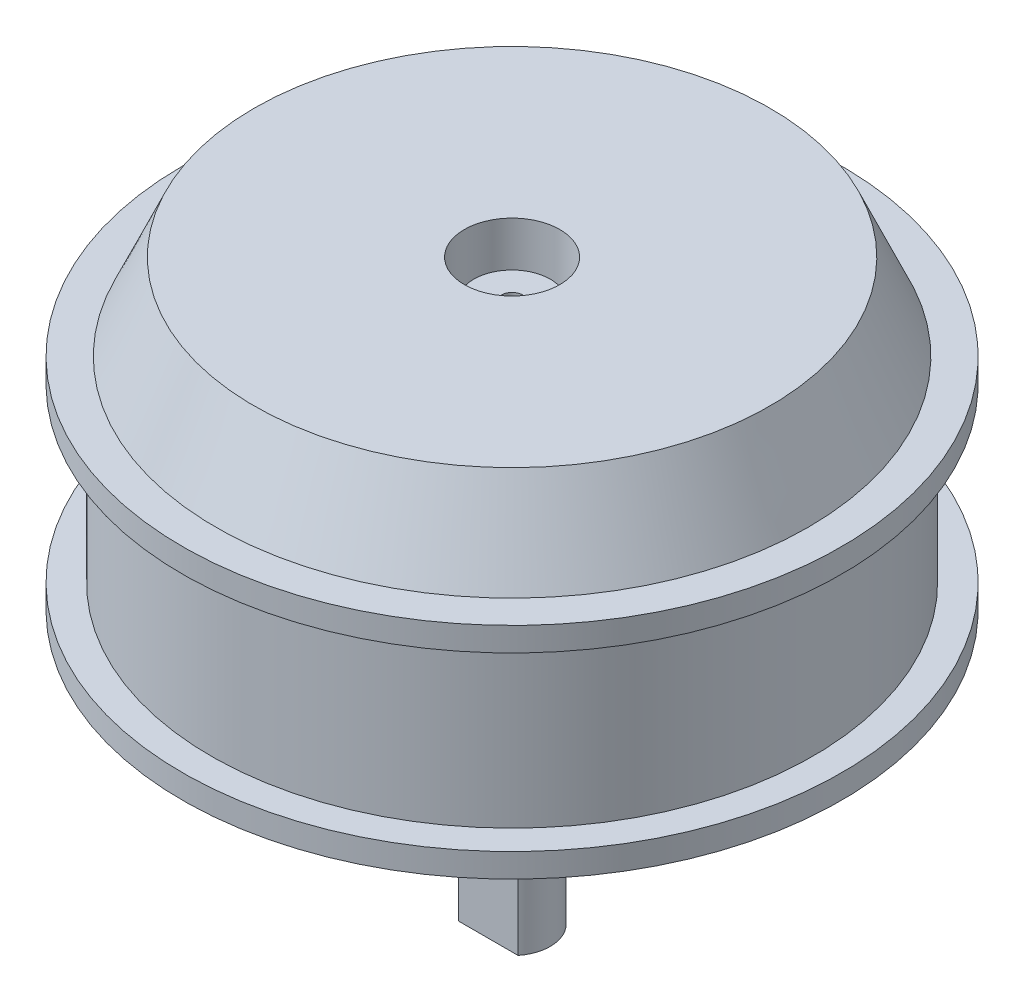
ISO-10303-21;
HEADER;
FILE_DESCRIPTION(('STEP AP214'),'2;1');
FILE_NAME('part.step','',(''),(''),'','','');
FILE_SCHEMA(('AUTOMOTIVE_DESIGN { 1 0 10303 214 1 1 1 1 }'));
ENDSEC;
DATA;
#1=APPLICATION_CONTEXT('core data for automotive mechanical design processes');
#2=APPLICATION_PROTOCOL_DEFINITION('international standard','automotive_design',2000,#1);
#3=PRODUCT_CONTEXT('',#1,'mechanical');
#4=PRODUCT('Part','Part','',(#3));
#5=PRODUCT_RELATED_PRODUCT_CATEGORY('part','',(#4));
#6=PRODUCT_DEFINITION_FORMATION('','',#4);
#7=PRODUCT_DEFINITION_CONTEXT('part definition',#1,'design');
#8=PRODUCT_DEFINITION('design','',#6,#7);
#9=PRODUCT_DEFINITION_SHAPE('','',#8);
#10=(LENGTH_UNIT() NAMED_UNIT(*) SI_UNIT(.MILLI.,.METRE.));
#11=(NAMED_UNIT(*) PLANE_ANGLE_UNIT() SI_UNIT($,.RADIAN.));
#12=(NAMED_UNIT(*) SI_UNIT($,.STERADIAN.) SOLID_ANGLE_UNIT());
#13=UNCERTAINTY_MEASURE_WITH_UNIT(LENGTH_MEASURE(1.E-05),#10,'distance_accuracy_value','');
#14=(GEOMETRIC_REPRESENTATION_CONTEXT(3) GLOBAL_UNCERTAINTY_ASSIGNED_CONTEXT((#13)) GLOBAL_UNIT_ASSIGNED_CONTEXT((#10,
#11,#12)) REPRESENTATION_CONTEXT('',''));
#15=CARTESIAN_POINT('',(0.,0.,0.));
#16=DIRECTION('',(0.,0.,1.));
#17=DIRECTION('',(1.,0.,0.));
#18=AXIS2_PLACEMENT_3D('',#15,#16,#17);
#19=CARTESIAN_POINT('',(0.,0.,0.));
#20=DIRECTION('',(0.,-1.,0.));
#21=DIRECTION('',(1.,0.,0.));
#22=AXIS2_PLACEMENT_3D('',#19,#20,#21);
#23=CONICAL_SURFACE('',#22,54.,0.418224329579229);
#24=CARTESIAN_POINT('',(0.,-18.,0.));
#25=DIRECTION('',(0.,1.,0.));
#26=DIRECTION('',(-1.,0.,0.));
#27=AXIS2_PLACEMENT_3D('',#24,#25,#26);
#28=CIRCLE('',#27,62.);
#29=CARTESIAN_POINT('',(-62.,-18.,0.));
#30=VERTEX_POINT('',#29);
#31=EDGE_CURVE('E207',#30,#30,#28,.T.);
#32=ORIENTED_EDGE('',*,*,#31,.T.);
#33=EDGE_LOOP('',(#32));
#34=FACE_BOUND('',#33,.T.);
#35=CARTESIAN_POINT('',(0.,0.,0.));
#36=DIRECTION('',(0.,1.,0.));
#37=DIRECTION('',(-1.,0.,0.));
#38=AXIS2_PLACEMENT_3D('',#35,#36,#37);
#39=CIRCLE('',#38,54.);
#40=CARTESIAN_POINT('',(-54.,0.,0.));
#41=VERTEX_POINT('',#40);
#42=EDGE_CURVE('E168',#41,#41,#39,.T.);
#43=ORIENTED_EDGE('',*,*,#42,.F.);
#44=EDGE_LOOP('',(#43));
#45=FACE_BOUND('',#44,.T.);
#46=ADVANCED_FACE('F38',(#34,#45),#23,.T.);
#47=CARTESIAN_POINT('',(-62.,-18.,0.));
#48=DIRECTION('',(0.,1.,0.));
#49=DIRECTION('',(-1.,0.,0.));
#50=AXIS2_PLACEMENT_3D('',#47,#48,#49);
#51=PLANE('',#50);
#52=CARTESIAN_POINT('',(0.,-18.,0.));
#53=DIRECTION('',(0.,1.,0.));
#54=DIRECTION('',(-1.,0.,0.));
#55=AXIS2_PLACEMENT_3D('',#52,#53,#54);
#56=CIRCLE('',#55,69.);
#57=CARTESIAN_POINT('',(-69.,-18.,0.));
#58=VERTEX_POINT('',#57);
#59=EDGE_CURVE('E204',#58,#58,#56,.T.);
#60=ORIENTED_EDGE('',*,*,#59,.T.);
#61=EDGE_LOOP('',(#60));
#62=FACE_BOUND('',#61,.T.);
#63=ORIENTED_EDGE('',*,*,#31,.F.);
#64=EDGE_LOOP('',(#63));
#65=FACE_BOUND('',#64,.T.);
#66=ADVANCED_FACE('F229',(#62,#65),#51,.T.);
#67=CARTESIAN_POINT('',(0.,-8.00000000000002,0.));
#68=DIRECTION('',(0.,1.,0.));
#69=DIRECTION('',(-1.,0.,0.));
#70=AXIS2_PLACEMENT_3D('',#67,#68,#69);
#71=CYLINDRICAL_SURFACE('',#70,69.);
#72=CARTESIAN_POINT('',(0.,-23.,0.));
#73=DIRECTION('',(0.,1.,0.));
#74=DIRECTION('',(-1.,0.,0.));
#75=AXIS2_PLACEMENT_3D('',#72,#73,#74);
#76=CIRCLE('',#75,69.);
#77=CARTESIAN_POINT('',(-69.,-23.,0.));
#78=VERTEX_POINT('',#77);
#79=EDGE_CURVE('E201',#78,#78,#76,.T.);
#80=ORIENTED_EDGE('',*,*,#79,.T.);
#81=EDGE_LOOP('',(#80));
#82=FACE_BOUND('',#81,.T.);
#83=ORIENTED_EDGE('',*,*,#59,.F.);
#84=EDGE_LOOP('',(#83));
#85=FACE_BOUND('',#84,.T.);
#86=ADVANCED_FACE('F234',(#82,#85),#71,.T.);
#87=CARTESIAN_POINT('',(-69.,-23.,0.));
#88=DIRECTION('',(0.,-1.,0.));
#89=DIRECTION('',(1.,0.,0.));
#90=AXIS2_PLACEMENT_3D('',#87,#88,#89);
#91=PLANE('',#90);
#92=CARTESIAN_POINT('',(0.,-23.,0.));
#93=DIRECTION('',(0.,1.,0.));
#94=DIRECTION('',(-1.,0.,0.));
#95=AXIS2_PLACEMENT_3D('',#92,#93,#94);
#96=CIRCLE('',#95,63.);
#97=CARTESIAN_POINT('',(-63.,-23.,0.));
#98=VERTEX_POINT('',#97);
#99=EDGE_CURVE('E198',#98,#98,#96,.T.);
#100=ORIENTED_EDGE('',*,*,#99,.T.);
#101=EDGE_LOOP('',(#100));
#102=FACE_BOUND('',#101,.T.);
#103=ORIENTED_EDGE('',*,*,#79,.F.);
#104=EDGE_LOOP('',(#103));
#105=FACE_BOUND('',#104,.T.);
#106=ADVANCED_FACE('F296',(#102,#105),#91,.T.);
#107=CARTESIAN_POINT('',(0.,-8.00000000000002,0.));
#108=DIRECTION('',(0.,1.,0.));
#109=DIRECTION('',(-1.,0.,0.));
#110=AXIS2_PLACEMENT_3D('',#107,#108,#109);
#111=CYLINDRICAL_SURFACE('',#110,63.);
#112=CARTESIAN_POINT('',(0.,-59.,0.));
#113=DIRECTION('',(0.,1.,0.));
#114=DIRECTION('',(-1.,0.,0.));
#115=AXIS2_PLACEMENT_3D('',#112,#113,#114);
#116=CIRCLE('',#115,63.);
#117=CARTESIAN_POINT('',(-63.,-59.,0.));
#118=VERTEX_POINT('',#117);
#119=EDGE_CURVE('E195',#118,#118,#116,.T.);
#120=ORIENTED_EDGE('',*,*,#119,.T.);
#121=EDGE_LOOP('',(#120));
#122=FACE_BOUND('',#121,.T.);
#123=ORIENTED_EDGE('',*,*,#99,.F.);
#124=EDGE_LOOP('',(#123));
#125=FACE_BOUND('',#124,.T.);
#126=ADVANCED_FACE('F292',(#122,#125),#111,.T.);
#127=CARTESIAN_POINT('',(-63.,-59.,0.));
#128=DIRECTION('',(0.,1.,0.));
#129=DIRECTION('',(-1.,0.,0.));
#130=AXIS2_PLACEMENT_3D('',#127,#128,#129);
#131=PLANE('',#130);
#132=CARTESIAN_POINT('',(0.,-59.,0.));
#133=DIRECTION('',(0.,1.,0.));
#134=DIRECTION('',(-1.,0.,0.));
#135=AXIS2_PLACEMENT_3D('',#132,#133,#134);
#136=CIRCLE('',#135,69.);
#137=CARTESIAN_POINT('',(-69.,-59.,0.));
#138=VERTEX_POINT('',#137);
#139=EDGE_CURVE('E192',#138,#138,#136,.T.);
#140=ORIENTED_EDGE('',*,*,#139,.T.);
#141=EDGE_LOOP('',(#140));
#142=FACE_BOUND('',#141,.T.);
#143=ORIENTED_EDGE('',*,*,#119,.F.);
#144=EDGE_LOOP('',(#143));
#145=FACE_BOUND('',#144,.T.);
#146=ADVANCED_FACE('F288',(#142,#145),#131,.T.);
#147=CARTESIAN_POINT('',(0.,-8.00000000000002,0.));
#148=DIRECTION('',(0.,1.,0.));
#149=DIRECTION('',(-1.,0.,0.));
#150=AXIS2_PLACEMENT_3D('',#147,#148,#149);
#151=CYLINDRICAL_SURFACE('',#150,69.);
#152=CARTESIAN_POINT('',(0.,-64.,0.));
#153=DIRECTION('',(0.,1.,0.));
#154=DIRECTION('',(-1.,0.,0.));
#155=AXIS2_PLACEMENT_3D('',#152,#153,#154);
#156=CIRCLE('',#155,69.);
#157=CARTESIAN_POINT('',(-69.,-64.,0.));
#158=VERTEX_POINT('',#157);
#159=EDGE_CURVE('E189',#158,#158,#156,.T.);
#160=ORIENTED_EDGE('',*,*,#159,.T.);
#161=EDGE_LOOP('',(#160));
#162=FACE_BOUND('',#161,.T.);
#163=ORIENTED_EDGE('',*,*,#139,.F.);
#164=EDGE_LOOP('',(#163));
#165=FACE_BOUND('',#164,.T.);
#166=ADVANCED_FACE('F284',(#162,#165),#151,.T.);
#167=CARTESIAN_POINT('',(-69.,-64.,0.));
#168=DIRECTION('',(0.,-1.,0.));
#169=DIRECTION('',(1.,0.,0.));
#170=AXIS2_PLACEMENT_3D('',#167,#168,#169);
#171=PLANE('',#170);
#172=CARTESIAN_POINT('',(51.3826826033579,-64.,-31.0025831017987));
#173=DIRECTION('',(0.,-1.,0.));
#174=DIRECTION('',(0.,0.,-1.));
#175=AXIS2_PLACEMENT_3D('',#172,#173,#174);
#176=CIRCLE('',#175,5.2);
#177=CARTESIAN_POINT('',(51.3826826033579,-64.,-36.2025831017987));
#178=VERTEX_POINT('',#177);
#179=EDGE_CURVE('E94',#178,#178,#176,.T.);
#180=ORIENTED_EDGE('',*,*,#179,.F.);
#181=EDGE_LOOP('',(#180));
#182=FACE_BOUND('',#181,.T.);
#183=CARTESIAN_POINT('',(52.5403658507747,-64.,28.9974168982014));
#184=DIRECTION('',(0.,-1.,0.));
#185=DIRECTION('',(0.,0.,-1.));
#186=AXIS2_PLACEMENT_3D('',#183,#184,#185);
#187=CIRCLE('',#186,5.2);
#188=CARTESIAN_POINT('',(52.5403658507747,-64.,23.7974168982014));
#189=VERTEX_POINT('',#188);
#190=EDGE_CURVE('E110',#189,#189,#187,.T.);
#191=ORIENTED_EDGE('',*,*,#190,.F.);
#192=EDGE_LOOP('',(#191));
#193=FACE_BOUND('',#192,.T.);
#194=CARTESIAN_POINT('',(1.15768324741619,-64.,60.));
#195=DIRECTION('',(0.,-1.,0.));
#196=DIRECTION('',(0.,0.,-1.));
#197=AXIS2_PLACEMENT_3D('',#194,#195,#196);
#198=CIRCLE('',#197,5.2);
#199=CARTESIAN_POINT('',(1.15768324741619,-64.,54.8));
#200=VERTEX_POINT('',#199);
#201=EDGE_CURVE('E119',#200,#200,#198,.T.);
#202=ORIENTED_EDGE('',*,*,#201,.F.);
#203=EDGE_LOOP('',(#202));
#204=FACE_BOUND('',#203,.T.);
#205=CARTESIAN_POINT('',(-51.3826826033581,-64.,31.0025831017983));
#206=DIRECTION('',(0.,-1.,0.));
#207=DIRECTION('',(0.,0.,-1.));
#208=AXIS2_PLACEMENT_3D('',#205,#206,#207);
#209=CIRCLE('',#208,5.2);
#210=CARTESIAN_POINT('',(-51.3826826033581,-64.,25.8025831017983));
#211=VERTEX_POINT('',#210);
#212=EDGE_CURVE('E128',#211,#211,#209,.T.);
#213=ORIENTED_EDGE('',*,*,#212,.F.);
#214=EDGE_LOOP('',(#213));
#215=FACE_BOUND('',#214,.T.);
#216=CARTESIAN_POINT('',(-52.5403658507745,-64.,-28.9974168982018));
#217=DIRECTION('',(0.,-1.,0.));
#218=DIRECTION('',(0.,0.,-1.));
#219=AXIS2_PLACEMENT_3D('',#216,#217,#218);
#220=CIRCLE('',#219,5.2);
#221=CARTESIAN_POINT('',(-52.5403658507745,-64.,-34.1974168982018));
#222=VERTEX_POINT('',#221);
#223=EDGE_CURVE('E137',#222,#222,#220,.T.);
#224=ORIENTED_EDGE('',*,*,#223,.F.);
#225=EDGE_LOOP('',(#224));
#226=FACE_BOUND('',#225,.T.);
#227=CARTESIAN_POINT('',(-1.15768324741619,-64.,-60.));
#228=DIRECTION('',(0.,-1.,0.));
#229=DIRECTION('',(0.,0.,-1.));
#230=AXIS2_PLACEMENT_3D('',#227,#228,#229);
#231=CIRCLE('',#230,5.2);
#232=CARTESIAN_POINT('',(-1.15768324741619,-64.,-65.2));
#233=VERTEX_POINT('',#232);
#234=EDGE_CURVE('E146',#233,#233,#231,.T.);
#235=ORIENTED_EDGE('',*,*,#234,.F.);
#236=EDGE_LOOP('',(#235));
#237=FACE_BOUND('',#236,.T.);
#238=CARTESIAN_POINT('',(0.,-64.,0.));
#239=DIRECTION('',(0.,1.,0.));
#240=DIRECTION('',(-1.,0.,0.));
#241=AXIS2_PLACEMENT_3D('',#238,#239,#240);
#242=CIRCLE('',#241,23.);
#243=CARTESIAN_POINT('',(-23.,-64.,0.));
#244=VERTEX_POINT('',#243);
#245=EDGE_CURVE('E186',#244,#244,#242,.T.);
#246=ORIENTED_EDGE('',*,*,#245,.T.);
#247=EDGE_LOOP('',(#246));
#248=FACE_BOUND('',#247,.T.);
#249=ORIENTED_EDGE('',*,*,#159,.F.);
#250=EDGE_LOOP('',(#249));
#251=FACE_BOUND('',#250,.T.);
#252=ADVANCED_FACE('F280',(#182,#193,#204,#215,#226,#237,#248,#251),#171,.T.);
#253=CARTESIAN_POINT('',(0.,-64.,0.));
#254=DIRECTION('',(0.,1.,0.));
#255=DIRECTION('',(-1.,0.,0.));
#256=AXIS2_PLACEMENT_3D('',#253,#254,#255);
#257=CONICAL_SURFACE('',#256,23.,1.15257199721567);
#258=CARTESIAN_POINT('',(0.,-68.,0.));
#259=DIRECTION('',(0.,1.,0.));
#260=DIRECTION('',(-1.,0.,0.));
#261=AXIS2_PLACEMENT_3D('',#258,#259,#260);
#262=CIRCLE('',#261,14.);
#263=CARTESIAN_POINT('',(-14.,-68.,0.));
#264=VERTEX_POINT('',#263);
#265=EDGE_CURVE('E183',#264,#264,#262,.T.);
#266=ORIENTED_EDGE('',*,*,#265,.T.);
#267=EDGE_LOOP('',(#266));
#268=FACE_BOUND('',#267,.T.);
#269=ORIENTED_EDGE('',*,*,#245,.F.);
#270=EDGE_LOOP('',(#269));
#271=FACE_BOUND('',#270,.T.);
#272=ADVANCED_FACE('F273',(#268,#271),#257,.T.);
#273=CARTESIAN_POINT('',(-14.,-68.,0.));
#274=DIRECTION('',(0.,-1.,0.));
#275=DIRECTION('',(1.,0.,0.));
#276=AXIS2_PLACEMENT_3D('',#273,#274,#275);
#277=PLANE('',#276);
#278=CARTESIAN_POINT('',(0.,-68.,0.));
#279=DIRECTION('',(0.,-1.,0.));
#280=DIRECTION('',(1.,0.,0.));
#281=AXIS2_PLACEMENT_3D('',#278,#279,#280);
#282=CIRCLE('',#281,9.95061624033845);
#283=CARTESIAN_POINT('',(9.95061624033845,-68.,0.));
#284=VERTEX_POINT('',#283);
#285=EDGE_CURVE('E739',#284,#284,#282,.T.);
#286=ORIENTED_EDGE('',*,*,#285,.F.);
#287=EDGE_LOOP('',(#286));
#288=FACE_BOUND('',#287,.T.);
#289=ORIENTED_EDGE('',*,*,#265,.F.);
#290=EDGE_LOOP('',(#289));
#291=FACE_BOUND('',#290,.T.);
#292=ADVANCED_FACE('F267',(#288,#291),#277,.T.);
#293=CARTESIAN_POINT('',(0.,-8.00000000000002,0.));
#294=DIRECTION('',(0.,1.,0.));
#295=DIRECTION('',(-1.,0.,0.));
#296=AXIS2_PLACEMENT_3D('',#293,#294,#295);
#297=PLANE('',#296);
#298=CARTESIAN_POINT('',(0.,-8.00000000000002,0.));
#299=DIRECTION('',(0.,1.,0.));
#300=DIRECTION('',(0.,0.,1.));
#301=AXIS2_PLACEMENT_3D('',#298,#299,#300);
#302=CIRCLE('',#301,2.25);
#303=CARTESIAN_POINT('',(0.,-8.00000000000002,2.25));
#304=VERTEX_POINT('',#303);
#305=EDGE_CURVE('E95',#304,#304,#302,.T.);
#306=ORIENTED_EDGE('',*,*,#305,.F.);
#307=EDGE_LOOP('',(#306));
#308=FACE_BOUND('',#307,.T.);
#309=CARTESIAN_POINT('',(0.,-8.00000000000002,0.));
#310=DIRECTION('',(0.,1.,0.));
#311=DIRECTION('',(-1.,0.,0.));
#312=AXIS2_PLACEMENT_3D('',#309,#310,#311);
#313=CIRCLE('',#312,8.);
#314=CARTESIAN_POINT('',(-8.,-8.00000000000002,0.));
#315=VERTEX_POINT('',#314);
#316=EDGE_CURVE('E180',#315,#315,#313,.T.);
#317=ORIENTED_EDGE('',*,*,#316,.T.);
#318=EDGE_LOOP('',(#317));
#319=FACE_BOUND('',#318,.T.);
#320=ADVANCED_FACE('F262',(#308,#319),#297,.T.);
#321=CARTESIAN_POINT('',(0.,-8.00000000000002,0.));
#322=DIRECTION('',(0.,1.,0.));
#323=DIRECTION('',(-1.,0.,0.));
#324=AXIS2_PLACEMENT_3D('',#321,#322,#323);
#325=CYLINDRICAL_SURFACE('',#324,8.);
#326=CARTESIAN_POINT('',(0.,-11.7305910328104,0.));
#327=DIRECTION('',(0.,1.,0.));
#328=DIRECTION('',(-1.,0.,0.));
#329=AXIS2_PLACEMENT_3D('',#326,#327,#328);
#330=CIRCLE('',#329,8.);
#331=CARTESIAN_POINT('',(-8.,-11.7305910328104,0.));
#332=VERTEX_POINT('',#331);
#333=EDGE_CURVE('E177',#332,#332,#330,.T.);
#334=ORIENTED_EDGE('',*,*,#333,.T.);
#335=EDGE_LOOP('',(#334));
#336=FACE_BOUND('',#335,.T.);
#337=ORIENTED_EDGE('',*,*,#316,.F.);
#338=EDGE_LOOP('',(#337));
#339=FACE_BOUND('',#338,.T.);
#340=ADVANCED_FACE('F256',(#336,#339),#325,.T.);
#341=CARTESIAN_POINT('',(-8.,-11.7305910328104,0.));
#342=DIRECTION('',(0.,1.,0.));
#343=DIRECTION('',(-1.,0.,0.));
#344=AXIS2_PLACEMENT_3D('',#341,#342,#343);
#345=PLANE('',#344);
#346=CARTESIAN_POINT('',(0.,-11.7305910328104,0.));
#347=DIRECTION('',(0.,1.,0.));
#348=DIRECTION('',(-1.,0.,0.));
#349=AXIS2_PLACEMENT_3D('',#346,#347,#348);
#350=CIRCLE('',#349,10.);
#351=CARTESIAN_POINT('',(-10.,-11.7305910328104,0.));
#352=VERTEX_POINT('',#351);
#353=EDGE_CURVE('E174',#352,#352,#350,.T.);
#354=ORIENTED_EDGE('',*,*,#353,.T.);
#355=EDGE_LOOP('',(#354));
#356=FACE_BOUND('',#355,.T.);
#357=ORIENTED_EDGE('',*,*,#333,.F.);
#358=EDGE_LOOP('',(#357));
#359=FACE_BOUND('',#358,.T.);
#360=ADVANCED_FACE('F250',(#356,#359),#345,.T.);
#361=CARTESIAN_POINT('',(0.,-8.00000000000002,0.));
#362=DIRECTION('',(0.,1.,0.));
#363=DIRECTION('',(-1.,0.,0.));
#364=AXIS2_PLACEMENT_3D('',#361,#362,#363);
#365=CYLINDRICAL_SURFACE('',#364,10.);
#366=CARTESIAN_POINT('',(0.,0.,0.));
#367=DIRECTION('',(0.,1.,0.));
#368=DIRECTION('',(-1.,0.,0.));
#369=AXIS2_PLACEMENT_3D('',#366,#367,#368);
#370=CIRCLE('',#369,10.);
#371=CARTESIAN_POINT('',(-10.,0.,0.));
#372=VERTEX_POINT('',#371);
#373=EDGE_CURVE('E171',#372,#372,#370,.T.);
#374=ORIENTED_EDGE('',*,*,#373,.T.);
#375=EDGE_LOOP('',(#374));
#376=FACE_BOUND('',#375,.T.);
#377=ORIENTED_EDGE('',*,*,#353,.F.);
#378=EDGE_LOOP('',(#377));
#379=FACE_BOUND('',#378,.T.);
#380=ADVANCED_FACE('F244',(#376,#379),#365,.F.);
#381=CARTESIAN_POINT('',(-10.,0.,0.));
#382=DIRECTION('',(0.,1.,0.));
#383=DIRECTION('',(-1.,0.,0.));
#384=AXIS2_PLACEMENT_3D('',#381,#382,#383);
#385=PLANE('',#384);
#386=ORIENTED_EDGE('',*,*,#42,.T.);
#387=EDGE_LOOP('',(#386));
#388=FACE_BOUND('',#387,.T.);
#389=ORIENTED_EDGE('',*,*,#373,.F.);
#390=EDGE_LOOP('',(#389));
#391=FACE_BOUND('',#390,.T.);
#392=ADVANCED_FACE('F240',(#388,#391),#385,.T.);
#393=CARTESIAN_POINT('',(-1.15768324741619,-50.,-60.));
#394=DIRECTION('',(0.,-1.,0.));
#395=DIRECTION('',(0.,0.,-1.));
#396=AXIS2_PLACEMENT_3D('',#393,#394,#395);
#397=CONICAL_SURFACE('',#396,2.74999999999999,1.02974425867665);
#398=CARTESIAN_POINT('',(-1.1576832474162,-48.3476332976742,-60.));
#399=VERTEX_POINT('',#398);
#400=VERTEX_LOOP('',#399);
#401=FACE_BOUND('',#400,.T.);
#402=CARTESIAN_POINT('',(-1.15768324741619,-50.,-60.));
#403=DIRECTION('',(0.,-1.,0.));
#404=DIRECTION('',(0.,0.,-1.));
#405=AXIS2_PLACEMENT_3D('',#402,#403,#404);
#406=CIRCLE('',#405,2.74999999999999);
#407=CARTESIAN_POINT('',(-1.15768324741619,-50.,-62.75));
#408=VERTEX_POINT('',#407);
#409=EDGE_CURVE('E152',#408,#408,#406,.T.);
#410=ORIENTED_EDGE('',*,*,#409,.T.);
#411=EDGE_LOOP('',(#410));
#412=FACE_BOUND('',#411,.T.);
#413=ADVANCED_FACE('F243',(#401,#412),#397,.F.);
#414=CARTESIAN_POINT('',(-1.15768324741619,-64.,-60.));
#415=DIRECTION('',(0.,-1.,0.));
#416=DIRECTION('',(0.,0.,-1.));
#417=AXIS2_PLACEMENT_3D('',#414,#415,#416);
#418=CYLINDRICAL_SURFACE('',#417,2.74999999999999);
#419=ORIENTED_EDGE('',*,*,#409,.F.);
#420=EDGE_LOOP('',(#419));
#421=FACE_BOUND('',#420,.T.);
#422=CARTESIAN_POINT('',(-1.15768324741619,-61.55,-60.));
#423=DIRECTION('',(0.,-1.,0.));
#424=DIRECTION('',(0.,0.,-1.));
#425=AXIS2_PLACEMENT_3D('',#422,#423,#424);
#426=CIRCLE('',#425,2.75);
#427=CARTESIAN_POINT('',(-1.15768324741619,-61.55,-62.75));
#428=VERTEX_POINT('',#427);
#429=EDGE_CURVE('E149',#428,#428,#426,.T.);
#430=ORIENTED_EDGE('',*,*,#429,.T.);
#431=EDGE_LOOP('',(#430));
#432=FACE_BOUND('',#431,.T.);
#433=ADVANCED_FACE('F556',(#421,#432),#418,.F.);
#434=CARTESIAN_POINT('',(-1.15768324741619,-64.,-60.));
#435=DIRECTION('',(0.,-1.,0.));
#436=DIRECTION('',(0.,0.,-1.));
#437=AXIS2_PLACEMENT_3D('',#434,#435,#436);
#438=CONICAL_SURFACE('',#437,5.2,0.785398163397449);
#439=ORIENTED_EDGE('',*,*,#429,.F.);
#440=EDGE_LOOP('',(#439));
#441=FACE_BOUND('',#440,.T.);
#442=ORIENTED_EDGE('',*,*,#234,.T.);
#443=EDGE_LOOP('',(#442));
#444=FACE_BOUND('',#443,.T.);
#445=ADVANCED_FACE('F547',(#441,#444),#438,.F.);
#446=CARTESIAN_POINT('',(-52.5403658507745,-50.,-28.9974168982018));
#447=DIRECTION('',(0.,-1.,0.));
#448=DIRECTION('',(0.,0.,-1.));
#449=AXIS2_PLACEMENT_3D('',#446,#447,#448);
#450=CONICAL_SURFACE('',#449,2.74999999999999,1.02974425867665);
#451=CARTESIAN_POINT('',(-52.5403658507745,-48.3476332976742,-28.9974168982018));
#452=VERTEX_POINT('',#451);
#453=VERTEX_LOOP('',#452);
#454=FACE_BOUND('',#453,.T.);
#455=CARTESIAN_POINT('',(-52.5403658507745,-50.,-28.9974168982018));
#456=DIRECTION('',(0.,-1.,0.));
#457=DIRECTION('',(0.,0.,-1.));
#458=AXIS2_PLACEMENT_3D('',#455,#456,#457);
#459=CIRCLE('',#458,2.74999999999999);
#460=CARTESIAN_POINT('',(-52.5403658507745,-50.,-31.7474168982018));
#461=VERTEX_POINT('',#460);
#462=EDGE_CURVE('E143',#461,#461,#459,.T.);
#463=ORIENTED_EDGE('',*,*,#462,.T.);
#464=EDGE_LOOP('',(#463));
#465=FACE_BOUND('',#464,.T.);
#466=ADVANCED_FACE('F537',(#454,#465),#450,.F.);
#467=CARTESIAN_POINT('',(-52.5403658507745,-64.,-28.9974168982018));
#468=DIRECTION('',(0.,-1.,0.));
#469=DIRECTION('',(0.,0.,-1.));
#470=AXIS2_PLACEMENT_3D('',#467,#468,#469);
#471=CYLINDRICAL_SURFACE('',#470,2.74999999999999);
#472=ORIENTED_EDGE('',*,*,#462,.F.);
#473=EDGE_LOOP('',(#472));
#474=FACE_BOUND('',#473,.T.);
#475=CARTESIAN_POINT('',(-52.5403658507745,-61.55,-28.9974168982018));
#476=DIRECTION('',(0.,-1.,0.));
#477=DIRECTION('',(0.,0.,-1.));
#478=AXIS2_PLACEMENT_3D('',#475,#476,#477);
#479=CIRCLE('',#478,2.75);
#480=CARTESIAN_POINT('',(-52.5403658507745,-61.55,-31.7474168982018));
#481=VERTEX_POINT('',#480);
#482=EDGE_CURVE('E140',#481,#481,#479,.T.);
#483=ORIENTED_EDGE('',*,*,#482,.T.);
#484=EDGE_LOOP('',(#483));
#485=FACE_BOUND('',#484,.T.);
#486=ADVANCED_FACE('F527',(#474,#485),#471,.F.);
#487=CARTESIAN_POINT('',(-52.5403658507745,-64.,-28.9974168982018));
#488=DIRECTION('',(0.,-1.,0.));
#489=DIRECTION('',(0.,0.,-1.));
#490=AXIS2_PLACEMENT_3D('',#487,#488,#489);
#491=CONICAL_SURFACE('',#490,5.2,0.785398163397448);
#492=ORIENTED_EDGE('',*,*,#482,.F.);
#493=EDGE_LOOP('',(#492));
#494=FACE_BOUND('',#493,.T.);
#495=ORIENTED_EDGE('',*,*,#223,.T.);
#496=EDGE_LOOP('',(#495));
#497=FACE_BOUND('',#496,.T.);
#498=ADVANCED_FACE('F517',(#494,#497),#491,.F.);
#499=CARTESIAN_POINT('',(-51.3826826033581,-50.,31.0025831017983));
#500=DIRECTION('',(0.,-1.,0.));
#501=DIRECTION('',(0.,0.,-1.));
#502=AXIS2_PLACEMENT_3D('',#499,#500,#501);
#503=CONICAL_SURFACE('',#502,2.74999999999999,1.02974425867665);
#504=CARTESIAN_POINT('',(-51.3826826033581,-48.3476332976742,31.0025831017983));
#505=VERTEX_POINT('',#504);
#506=VERTEX_LOOP('',#505);
#507=FACE_BOUND('',#506,.T.);
#508=CARTESIAN_POINT('',(-51.3826826033581,-50.,31.0025831017983));
#509=DIRECTION('',(0.,-1.,0.));
#510=DIRECTION('',(0.,0.,-1.));
#511=AXIS2_PLACEMENT_3D('',#508,#509,#510);
#512=CIRCLE('',#511,2.74999999999999);
#513=CARTESIAN_POINT('',(-51.3826826033581,-50.,28.2525831017983));
#514=VERTEX_POINT('',#513);
#515=EDGE_CURVE('E134',#514,#514,#512,.T.);
#516=ORIENTED_EDGE('',*,*,#515,.T.);
#517=EDGE_LOOP('',(#516));
#518=FACE_BOUND('',#517,.T.);
#519=ADVANCED_FACE('F507',(#507,#518),#503,.F.);
#520=CARTESIAN_POINT('',(-51.3826826033581,-64.,31.0025831017983));
#521=DIRECTION('',(0.,-1.,0.));
#522=DIRECTION('',(0.,0.,-1.));
#523=AXIS2_PLACEMENT_3D('',#520,#521,#522);
#524=CYLINDRICAL_SURFACE('',#523,2.74999999999999);
#525=ORIENTED_EDGE('',*,*,#515,.F.);
#526=EDGE_LOOP('',(#525));
#527=FACE_BOUND('',#526,.T.);
#528=CARTESIAN_POINT('',(-51.3826826033581,-61.55,31.0025831017983));
#529=DIRECTION('',(0.,-1.,0.));
#530=DIRECTION('',(0.,0.,-1.));
#531=AXIS2_PLACEMENT_3D('',#528,#529,#530);
#532=CIRCLE('',#531,2.75);
#533=CARTESIAN_POINT('',(-51.3826826033581,-61.55,28.2525831017983));
#534=VERTEX_POINT('',#533);
#535=EDGE_CURVE('E131',#534,#534,#532,.T.);
#536=ORIENTED_EDGE('',*,*,#535,.T.);
#537=EDGE_LOOP('',(#536));
#538=FACE_BOUND('',#537,.T.);
#539=ADVANCED_FACE('F497',(#527,#538),#524,.F.);
#540=CARTESIAN_POINT('',(-51.3826826033581,-64.,31.0025831017983));
#541=DIRECTION('',(0.,-1.,0.));
#542=DIRECTION('',(0.,0.,-1.));
#543=AXIS2_PLACEMENT_3D('',#540,#541,#542);
#544=CONICAL_SURFACE('',#543,5.2,0.785398163397448);
#545=ORIENTED_EDGE('',*,*,#535,.F.);
#546=EDGE_LOOP('',(#545));
#547=FACE_BOUND('',#546,.T.);
#548=ORIENTED_EDGE('',*,*,#212,.T.);
#549=EDGE_LOOP('',(#548));
#550=FACE_BOUND('',#549,.T.);
#551=ADVANCED_FACE('F487',(#547,#550),#544,.F.);
#552=CARTESIAN_POINT('',(1.15768324741619,-50.,60.));
#553=DIRECTION('',(0.,-1.,0.));
#554=DIRECTION('',(0.,0.,-1.));
#555=AXIS2_PLACEMENT_3D('',#552,#553,#554);
#556=CONICAL_SURFACE('',#555,2.74999999999999,1.02974425867665);
#557=CARTESIAN_POINT('',(1.15768324741619,-48.3476332976742,60.));
#558=VERTEX_POINT('',#557);
#559=VERTEX_LOOP('',#558);
#560=FACE_BOUND('',#559,.T.);
#561=CARTESIAN_POINT('',(1.15768324741619,-50.,60.));
#562=DIRECTION('',(0.,-1.,0.));
#563=DIRECTION('',(0.,0.,-1.));
#564=AXIS2_PLACEMENT_3D('',#561,#562,#563);
#565=CIRCLE('',#564,2.74999999999999);
#566=CARTESIAN_POINT('',(1.15768324741619,-50.,57.25));
#567=VERTEX_POINT('',#566);
#568=EDGE_CURVE('E125',#567,#567,#565,.T.);
#569=ORIENTED_EDGE('',*,*,#568,.T.);
#570=EDGE_LOOP('',(#569));
#571=FACE_BOUND('',#570,.T.);
#572=ADVANCED_FACE('F477',(#560,#571),#556,.F.);
#573=CARTESIAN_POINT('',(1.15768324741619,-64.,60.));
#574=DIRECTION('',(0.,-1.,0.));
#575=DIRECTION('',(0.,0.,-1.));
#576=AXIS2_PLACEMENT_3D('',#573,#574,#575);
#577=CYLINDRICAL_SURFACE('',#576,2.74999999999999);
#578=ORIENTED_EDGE('',*,*,#568,.F.);
#579=EDGE_LOOP('',(#578));
#580=FACE_BOUND('',#579,.T.);
#581=CARTESIAN_POINT('',(1.15768324741619,-61.55,60.));
#582=DIRECTION('',(0.,-1.,0.));
#583=DIRECTION('',(0.,0.,-1.));
#584=AXIS2_PLACEMENT_3D('',#581,#582,#583);
#585=CIRCLE('',#584,2.75);
#586=CARTESIAN_POINT('',(1.15768324741619,-61.55,57.25));
#587=VERTEX_POINT('',#586);
#588=EDGE_CURVE('E122',#587,#587,#585,.T.);
#589=ORIENTED_EDGE('',*,*,#588,.T.);
#590=EDGE_LOOP('',(#589));
#591=FACE_BOUND('',#590,.T.);
#592=ADVANCED_FACE('F467',(#580,#591),#577,.F.);
#593=CARTESIAN_POINT('',(1.15768324741619,-64.,60.));
#594=DIRECTION('',(0.,-1.,0.));
#595=DIRECTION('',(0.,0.,-1.));
#596=AXIS2_PLACEMENT_3D('',#593,#594,#595);
#597=CONICAL_SURFACE('',#596,5.2,0.785398163397449);
#598=ORIENTED_EDGE('',*,*,#588,.F.);
#599=EDGE_LOOP('',(#598));
#600=FACE_BOUND('',#599,.T.);
#601=ORIENTED_EDGE('',*,*,#201,.T.);
#602=EDGE_LOOP('',(#601));
#603=FACE_BOUND('',#602,.T.);
#604=ADVANCED_FACE('F457',(#600,#603),#597,.F.);
#605=CARTESIAN_POINT('',(52.5403658507747,-50.,28.9974168982014));
#606=DIRECTION('',(0.,-1.,0.));
#607=DIRECTION('',(0.,0.,-1.));
#608=AXIS2_PLACEMENT_3D('',#605,#606,#607);
#609=CONICAL_SURFACE('',#608,2.74999999999999,1.02974425867665);
#610=CARTESIAN_POINT('',(52.5403658507747,-48.3476332976742,28.9974168982014));
#611=VERTEX_POINT('',#610);
#612=VERTEX_LOOP('',#611);
#613=FACE_BOUND('',#612,.T.);
#614=CARTESIAN_POINT('',(52.5403658507747,-50.,28.9974168982014));
#615=DIRECTION('',(0.,-1.,0.));
#616=DIRECTION('',(0.,0.,-1.));
#617=AXIS2_PLACEMENT_3D('',#614,#615,#616);
#618=CIRCLE('',#617,2.74999999999999);
#619=CARTESIAN_POINT('',(52.5403658507747,-50.,26.2474168982014));
#620=VERTEX_POINT('',#619);
#621=EDGE_CURVE('E116',#620,#620,#618,.T.);
#622=ORIENTED_EDGE('',*,*,#621,.T.);
#623=EDGE_LOOP('',(#622));
#624=FACE_BOUND('',#623,.T.);
#625=ADVANCED_FACE('F447',(#613,#624),#609,.F.);
#626=CARTESIAN_POINT('',(52.5403658507747,-64.,28.9974168982014));
#627=DIRECTION('',(0.,-1.,0.));
#628=DIRECTION('',(0.,0.,-1.));
#629=AXIS2_PLACEMENT_3D('',#626,#627,#628);
#630=CYLINDRICAL_SURFACE('',#629,2.74999999999999);
#631=ORIENTED_EDGE('',*,*,#621,.F.);
#632=EDGE_LOOP('',(#631));
#633=FACE_BOUND('',#632,.T.);
#634=CARTESIAN_POINT('',(52.5403658507747,-61.55,28.9974168982014));
#635=DIRECTION('',(0.,-1.,0.));
#636=DIRECTION('',(0.,0.,-1.));
#637=AXIS2_PLACEMENT_3D('',#634,#635,#636);
#638=CIRCLE('',#637,2.75);
#639=CARTESIAN_POINT('',(52.5403658507747,-61.55,26.2474168982014));
#640=VERTEX_POINT('',#639);
#641=EDGE_CURVE('E113',#640,#640,#638,.T.);
#642=ORIENTED_EDGE('',*,*,#641,.T.);
#643=EDGE_LOOP('',(#642));
#644=FACE_BOUND('',#643,.T.);
#645=ADVANCED_FACE('F437',(#633,#644),#630,.F.);
#646=CARTESIAN_POINT('',(52.5403658507747,-64.,28.9974168982014));
#647=DIRECTION('',(0.,-1.,0.));
#648=DIRECTION('',(0.,0.,-1.));
#649=AXIS2_PLACEMENT_3D('',#646,#647,#648);
#650=CONICAL_SURFACE('',#649,5.2,0.78539816339745);
#651=ORIENTED_EDGE('',*,*,#641,.F.);
#652=EDGE_LOOP('',(#651));
#653=FACE_BOUND('',#652,.T.);
#654=ORIENTED_EDGE('',*,*,#190,.T.);
#655=EDGE_LOOP('',(#654));
#656=FACE_BOUND('',#655,.T.);
#657=ADVANCED_FACE('F427',(#653,#656),#650,.F.);
#658=CARTESIAN_POINT('',(51.3826826033579,-50.,-31.0025831017987));
#659=DIRECTION('',(0.,-1.,0.));
#660=DIRECTION('',(0.,0.,-1.));
#661=AXIS2_PLACEMENT_3D('',#658,#659,#660);
#662=CONICAL_SURFACE('',#661,2.74999999999999,1.02974425867665);
#663=CARTESIAN_POINT('',(51.3826826033578,-48.3476332976742,-31.0025831017987));
#664=VERTEX_POINT('',#663);
#665=VERTEX_LOOP('',#664);
#666=FACE_BOUND('',#665,.T.);
#667=CARTESIAN_POINT('',(51.3826826033579,-50.,-31.0025831017987));
#668=DIRECTION('',(0.,-1.,0.));
#669=DIRECTION('',(0.,0.,-1.));
#670=AXIS2_PLACEMENT_3D('',#667,#668,#669);
#671=CIRCLE('',#670,2.74999999999999);
#672=CARTESIAN_POINT('',(51.3826826033579,-50.,-33.7525831017987));
#673=VERTEX_POINT('',#672);
#674=EDGE_CURVE('E107',#673,#673,#671,.T.);
#675=ORIENTED_EDGE('',*,*,#674,.T.);
#676=EDGE_LOOP('',(#675));
#677=FACE_BOUND('',#676,.T.);
#678=ADVANCED_FACE('F417',(#666,#677),#662,.F.);
#679=CARTESIAN_POINT('',(51.3826826033579,-64.,-31.0025831017987));
#680=DIRECTION('',(0.,-1.,0.));
#681=DIRECTION('',(0.,0.,-1.));
#682=AXIS2_PLACEMENT_3D('',#679,#680,#681);
#683=CYLINDRICAL_SURFACE('',#682,2.74999999999999);
#684=ORIENTED_EDGE('',*,*,#674,.F.);
#685=EDGE_LOOP('',(#684));
#686=FACE_BOUND('',#685,.T.);
#687=CARTESIAN_POINT('',(51.3826826033579,-61.55,-31.0025831017987));
#688=DIRECTION('',(0.,-1.,0.));
#689=DIRECTION('',(0.,0.,-1.));
#690=AXIS2_PLACEMENT_3D('',#687,#688,#689);
#691=CIRCLE('',#690,2.75);
#692=CARTESIAN_POINT('',(51.3826826033579,-61.55,-33.7525831017987));
#693=VERTEX_POINT('',#692);
#694=EDGE_CURVE('E98',#693,#693,#691,.T.);
#695=ORIENTED_EDGE('',*,*,#694,.T.);
#696=EDGE_LOOP('',(#695));
#697=FACE_BOUND('',#696,.T.);
#698=ADVANCED_FACE('F407',(#686,#697),#683,.F.);
#699=CARTESIAN_POINT('',(51.3826826033579,-64.,-31.0025831017987));
#700=DIRECTION('',(0.,-1.,0.));
#701=DIRECTION('',(0.,0.,-1.));
#702=AXIS2_PLACEMENT_3D('',#699,#700,#701);
#703=CONICAL_SURFACE('',#702,5.2,0.78539816339745);
#704=ORIENTED_EDGE('',*,*,#694,.F.);
#705=EDGE_LOOP('',(#704));
#706=FACE_BOUND('',#705,.T.);
#707=ORIENTED_EDGE('',*,*,#179,.T.);
#708=EDGE_LOOP('',(#707));
#709=FACE_BOUND('',#708,.T.);
#710=ADVANCED_FACE('F88',(#706,#709),#703,.F.);
#711=CARTESIAN_POINT('',(0.,-22.,0.));
#712=DIRECTION('',(0.,1.,0.));
#713=DIRECTION('',(0.,0.,1.));
#714=AXIS2_PLACEMENT_3D('',#711,#712,#713);
#715=CONICAL_SURFACE('',#714,2.25,1.02974425867665);
#716=CARTESIAN_POINT('',(0.,-23.351936392812,0.));
#717=VERTEX_POINT('',#716);
#718=VERTEX_LOOP('',#717);
#719=FACE_BOUND('',#718,.T.);
#720=CARTESIAN_POINT('',(0.,-22.,0.));
#721=DIRECTION('',(0.,1.,0.));
#722=DIRECTION('',(0.,0.,1.));
#723=AXIS2_PLACEMENT_3D('',#720,#721,#722);
#724=CIRCLE('',#723,2.25);
#725=CARTESIAN_POINT('',(0.,-22.,2.25));
#726=VERTEX_POINT('',#725);
#727=EDGE_CURVE('E92',#726,#726,#724,.T.);
#728=ORIENTED_EDGE('',*,*,#727,.T.);
#729=EDGE_LOOP('',(#728));
#730=FACE_BOUND('',#729,.T.);
#731=ADVANCED_FACE('F84',(#719,#730),#715,.F.);
#732=CARTESIAN_POINT('',(0.,-8.00000000000002,0.));
#733=DIRECTION('',(0.,1.,0.));
#734=DIRECTION('',(0.,0.,1.));
#735=AXIS2_PLACEMENT_3D('',#732,#733,#734);
#736=CYLINDRICAL_SURFACE('',#735,2.25);
#737=ORIENTED_EDGE('',*,*,#727,.F.);
#738=EDGE_LOOP('',(#737));
#739=FACE_BOUND('',#738,.T.);
#740=ORIENTED_EDGE('',*,*,#305,.T.);
#741=EDGE_LOOP('',(#740));
#742=FACE_BOUND('',#741,.T.);
#743=ADVANCED_FACE('F87',(#739,#742),#736,.F.);
#744=CARTESIAN_POINT('',(0.,-58.,0.));
#745=DIRECTION('',(0.,-1.,0.));
#746=DIRECTION('',(1.,0.,0.));
#747=AXIS2_PLACEMENT_3D('',#744,#745,#746);
#748=CYLINDRICAL_SURFACE('',#747,9.95061624033845);
#749=CARTESIAN_POINT('',(0.,-58.,0.));
#750=DIRECTION('',(0.,-1.,0.));
#751=DIRECTION('',(1.,0.,0.));
#752=AXIS2_PLACEMENT_3D('',#749,#750,#751);
#753=CIRCLE('',#752,9.95061624033845);
#754=CARTESIAN_POINT('',(9.95061624033845,-58.,0.));
#755=VERTEX_POINT('',#754);
#756=EDGE_CURVE('E101',#755,#755,#753,.T.);
#757=ORIENTED_EDGE('',*,*,#756,.F.);
#758=EDGE_LOOP('',(#757));
#759=FACE_BOUND('',#758,.T.);
#760=ORIENTED_EDGE('',*,*,#285,.T.);
#761=EDGE_LOOP('',(#760));
#762=FACE_BOUND('',#761,.T.);
#763=ADVANCED_FACE('F354',(#759,#762),#748,.F.);
#764=CARTESIAN_POINT('',(0.,-58.,0.));
#765=DIRECTION('',(0.,-1.,0.));
#766=DIRECTION('',(1.,0.,0.));
#767=AXIS2_PLACEMENT_3D('',#764,#765,#766);
#768=PLANE('',#767);
#769=CARTESIAN_POINT('',(0.,-58.,0.));
#770=DIRECTION('',(0.,-1.,0.));
#771=DIRECTION('',(1.,0.,0.));
#772=AXIS2_PLACEMENT_3D('',#769,#770,#771);
#773=CIRCLE('',#772,8.);
#774=CARTESIAN_POINT('',(8.,-58.,0.));
#775=VERTEX_POINT('',#774);
#776=EDGE_CURVE('E736',#775,#775,#773,.T.);
#777=ORIENTED_EDGE('',*,*,#776,.F.);
#778=EDGE_LOOP('',(#777));
#779=FACE_BOUND('',#778,.T.);
#780=ORIENTED_EDGE('',*,*,#756,.T.);
#781=EDGE_LOOP('',(#780));
#782=FACE_BOUND('',#781,.T.);
#783=ADVANCED_FACE('F359',(#779,#782),#768,.T.);
#784=CARTESIAN_POINT('',(0.,-51.,0.));
#785=DIRECTION('',(0.,-1.,0.));
#786=DIRECTION('',(0.,0.,-1.));
#787=AXIS2_PLACEMENT_3D('',#784,#785,#786);
#788=PLANE('',#787);
#789=CARTESIAN_POINT('',(0.,-51.,0.));
#790=DIRECTION('',(0.,-1.,0.));
#791=DIRECTION('',(0.,0.,-1.));
#792=AXIS2_PLACEMENT_3D('',#789,#790,#791);
#793=CIRCLE('',#792,3.5);
#794=CARTESIAN_POINT('',(0.,-51.,-3.5));
#795=VERTEX_POINT('',#794);
#796=EDGE_CURVE('E156',#795,#795,#793,.T.);
#797=ORIENTED_EDGE('',*,*,#796,.T.);
#798=EDGE_LOOP('',(#797));
#799=FACE_BOUND('',#798,.T.);
#800=ADVANCED_FACE('F370',(#799),#788,.T.);
#801=CARTESIAN_POINT('',(0.,-51.,0.));
#802=DIRECTION('',(0.,-1.,0.));
#803=DIRECTION('',(0.,0.,-1.));
#804=AXIS2_PLACEMENT_3D('',#801,#802,#803);
#805=CYLINDRICAL_SURFACE('',#804,3.5);
#806=ORIENTED_EDGE('',*,*,#796,.F.);
#807=EDGE_LOOP('',(#806));
#808=FACE_BOUND('',#807,.T.);
#809=CARTESIAN_POINT('',(0.,-121.,0.));
#810=DIRECTION('',(0.,-1.,0.));
#811=DIRECTION('',(0.,0.,-1.));
#812=AXIS2_PLACEMENT_3D('',#809,#810,#811);
#813=CIRCLE('',#812,3.5);
#814=CARTESIAN_POINT('',(0.,-121.,-3.5));
#815=VERTEX_POINT('',#814);
#816=EDGE_CURVE('E155',#815,#815,#813,.T.);
#817=ORIENTED_EDGE('',*,*,#816,.T.);
#818=EDGE_LOOP('',(#817));
#819=FACE_BOUND('',#818,.T.);
#820=ADVANCED_FACE('F584',(#808,#819),#805,.F.);
#821=CARTESIAN_POINT('',(0.,-75.,0.));
#822=DIRECTION('',(0.,-1.,0.));
#823=DIRECTION('',(0.,0.,-1.));
#824=AXIS2_PLACEMENT_3D('',#821,#822,#823);
#825=PLANE('',#824);
#826=CARTESIAN_POINT('',(0.,-75.,0.));
#827=DIRECTION('',(0.,-1.,0.));
#828=DIRECTION('',(0.,0.,-1.));
#829=AXIS2_PLACEMENT_3D('',#826,#827,#828);
#830=CIRCLE('',#829,8.);
#831=CARTESIAN_POINT('',(6.2449979983984,-75.,5.));
#832=VERTEX_POINT('',#831);
#833=CARTESIAN_POINT('',(-6.2449979983984,-75.,5.));
#834=VERTEX_POINT('',#833);
#835=EDGE_CURVE('E11',#832,#834,#830,.T.);
#836=ORIENTED_EDGE('',*,*,#835,.T.);
#837=DIRECTION('',(1.,0.,0.));
#838=VECTOR('',#837,1.);
#839=CARTESIAN_POINT('',(-11.0001675796054,-75.,5.));
#840=LINE('',#839,#838);
#841=EDGE_CURVE('E159',#834,#832,#840,.T.);
#842=ORIENTED_EDGE('',*,*,#841,.T.);
#843=EDGE_LOOP('',(#836,#842));
#844=FACE_BOUND('',#843,.T.);
#845=ADVANCED_FACE('F225',(#844),#825,.T.);
#846=CARTESIAN_POINT('',(-11.0001675796054,-75.,5.));
#847=DIRECTION('',(0.,0.,-1.));
#848=DIRECTION('',(-1.,0.,0.));
#849=AXIS2_PLACEMENT_3D('',#846,#847,#848);
#850=PLANE('',#849);
#851=DIRECTION('',(1.,0.,0.));
#852=VECTOR('',#851,1.);
#853=CARTESIAN_POINT('',(0.,-121.,5.));
#854=LINE('',#853,#852);
#855=CARTESIAN_POINT('',(-6.2449979983984,-121.,5.));
#856=VERTEX_POINT('',#855);
#857=CARTESIAN_POINT('',(6.2449979983984,-121.,5.));
#858=VERTEX_POINT('',#857);
#859=EDGE_CURVE('E45',#856,#858,#854,.T.);
#860=ORIENTED_EDGE('',*,*,#859,.T.);
#861=DIRECTION('',(0.,1.,0.));
#862=VECTOR('',#861,1.);
#863=CARTESIAN_POINT('',(6.2449979983984,-121.,5.));
#864=LINE('',#863,#862);
#865=EDGE_CURVE('E57',#832,#858,#864,.F.);
#866=ORIENTED_EDGE('',*,*,#865,.F.);
#867=ORIENTED_EDGE('',*,*,#841,.F.);
#868=DIRECTION('',(0.,1.,0.));
#869=VECTOR('',#868,1.);
#870=CARTESIAN_POINT('',(-6.2449979983984,-121.,5.));
#871=LINE('',#870,#869);
#872=EDGE_CURVE('E52',#856,#834,#871,.T.);
#873=ORIENTED_EDGE('',*,*,#872,.F.);
#874=EDGE_LOOP('',(#860,#866,#867,#873));
#875=FACE_BOUND('',#874,.T.);
#876=ADVANCED_FACE('F209',(#875),#850,.F.);
#877=CARTESIAN_POINT('',(0.,-121.,0.));
#878=DIRECTION('',(0.,-1.,0.));
#879=DIRECTION('',(0.,0.,-1.));
#880=AXIS2_PLACEMENT_3D('',#877,#878,#879);
#881=PLANE('',#880);
#882=ORIENTED_EDGE('',*,*,#816,.F.);
#883=EDGE_LOOP('',(#882));
#884=FACE_BOUND('',#883,.T.);
#885=ORIENTED_EDGE('',*,*,#859,.F.);
#886=CARTESIAN_POINT('',(0.,-121.,0.));
#887=DIRECTION('',(0.,-1.,0.));
#888=DIRECTION('',(0.,0.,-1.));
#889=AXIS2_PLACEMENT_3D('',#886,#887,#888);
#890=CIRCLE('',#889,8.);
#891=EDGE_CURVE('E165',#856,#858,#890,.T.);
#892=ORIENTED_EDGE('',*,*,#891,.T.);
#893=EDGE_LOOP('',(#885,#892));
#894=FACE_BOUND('',#893,.T.);
#895=ADVANCED_FACE('F216',(#884,#894),#881,.T.);
#896=CARTESIAN_POINT('',(0.,-121.,0.));
#897=DIRECTION('',(0.,1.,0.));
#898=DIRECTION('',(0.,0.,1.));
#899=AXIS2_PLACEMENT_3D('',#896,#897,#898);
#900=CYLINDRICAL_SURFACE('',#899,8.);
#901=ORIENTED_EDGE('',*,*,#891,.F.);
#902=ORIENTED_EDGE('',*,*,#872,.T.);
#903=ORIENTED_EDGE('',*,*,#835,.F.);
#904=ORIENTED_EDGE('',*,*,#865,.T.);
#905=EDGE_LOOP('',(#901,#902,#903,#904));
#906=FACE_BOUND('',#905,.T.);
#907=ORIENTED_EDGE('',*,*,#776,.T.);
#908=EDGE_LOOP('',(#907));
#909=FACE_BOUND('',#908,.T.);
#910=ADVANCED_FACE('F214',(#906,#909),#900,.T.);
#911=CLOSED_SHELL('',(#46,#66,#86,#106,#126,#146,#166,#252,#272,#292,#320,#340,#360,#380,#392,
#413,#433,#445,#466,#486,#498,#519,#539,#551,#572,#592,#604,#625,#645,#657,#678,#698,#710,#731,
#743,#763,#783,#800,#820,#845,#876,#895,#910));
#912=MANIFOLD_SOLID_BREP('B2',#911);
#913=ADVANCED_BREP_SHAPE_REPRESENTATION('',(#18,#912),#14);
#914=SHAPE_DEFINITION_REPRESENTATION(#9,#913);
ENDSEC;
END-ISO-10303-21;
